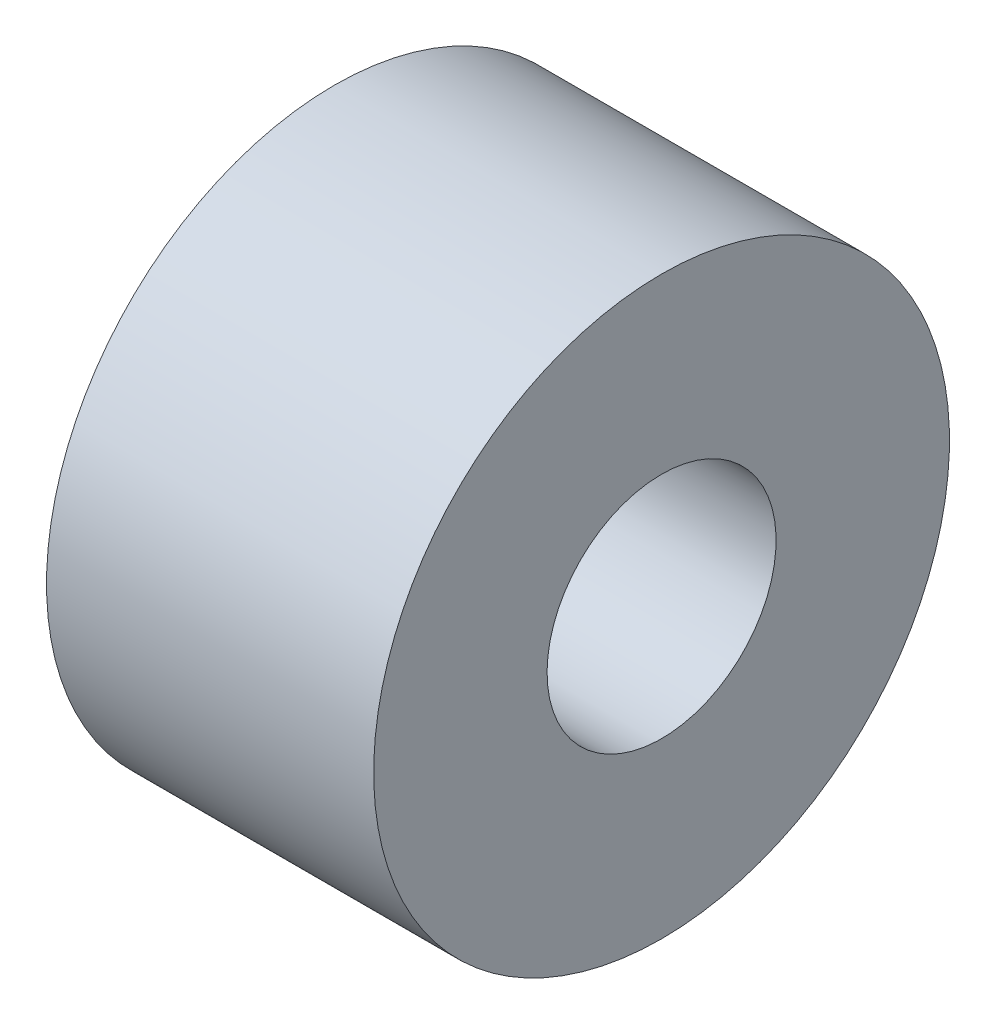
ISO-10303-21;
HEADER;
FILE_DESCRIPTION(('STEP AP214'),'2;1');
FILE_NAME('part.step','',(''),(''),'','','');
FILE_SCHEMA(('AUTOMOTIVE_DESIGN { 1 0 10303 214 1 1 1 1 }'));
ENDSEC;
DATA;
#1=APPLICATION_CONTEXT('core data for automotive mechanical design processes');
#2=APPLICATION_PROTOCOL_DEFINITION('international standard','automotive_design',2000,#1);
#3=PRODUCT_CONTEXT('',#1,'mechanical');
#4=PRODUCT('Part','Part','',(#3));
#5=PRODUCT_RELATED_PRODUCT_CATEGORY('part','',(#4));
#6=PRODUCT_DEFINITION_FORMATION('','',#4);
#7=PRODUCT_DEFINITION_CONTEXT('part definition',#1,'design');
#8=PRODUCT_DEFINITION('design','',#6,#7);
#9=PRODUCT_DEFINITION_SHAPE('','',#8);
#10=(LENGTH_UNIT() NAMED_UNIT(*) SI_UNIT(.MILLI.,.METRE.));
#11=(NAMED_UNIT(*) PLANE_ANGLE_UNIT() SI_UNIT($,.RADIAN.));
#12=(NAMED_UNIT(*) SI_UNIT($,.STERADIAN.) SOLID_ANGLE_UNIT());
#13=UNCERTAINTY_MEASURE_WITH_UNIT(LENGTH_MEASURE(1.E-05),#10,'distance_accuracy_value','');
#14=(GEOMETRIC_REPRESENTATION_CONTEXT(3) GLOBAL_UNCERTAINTY_ASSIGNED_CONTEXT((#13)) GLOBAL_UNIT_ASSIGNED_CONTEXT((#10,
#11,#12)) REPRESENTATION_CONTEXT('',''));
#15=CARTESIAN_POINT('',(0.,0.,0.));
#16=DIRECTION('',(0.,0.,1.));
#17=DIRECTION('',(1.,0.,0.));
#18=AXIS2_PLACEMENT_3D('',#15,#16,#17);
#19=CARTESIAN_POINT('',(43.1,-2.35608336515726,-40.657629981637));
#20=DIRECTION('',(1.,0.,0.));
#21=DIRECTION('',(0.,-0.17364817766693,-0.984807753012208));
#22=AXIS2_PLACEMENT_3D('',#19,#20,#21);
#23=CYLINDRICAL_SURFACE('',#22,1.75);
#24=CARTESIAN_POINT('',(48.1,-2.35608336515726,-40.657629981637));
#25=DIRECTION('',(-1.,0.,0.));
#26=DIRECTION('',(0.,-0.17364817766693,-0.984807753012208));
#27=AXIS2_PLACEMENT_3D('',#24,#25,#26);
#28=CIRCLE('',#27,1.75);
#29=CARTESIAN_POINT('',(48.1,-2.65996767607439,-42.3810435494084));
#30=VERTEX_POINT('',#29);
#31=EDGE_CURVE('E26',#30,#30,#28,.T.);
#32=ORIENTED_EDGE('',*,*,#31,.F.);
#33=EDGE_LOOP('',(#32));
#34=FACE_BOUND('',#33,.T.);
#35=CARTESIAN_POINT('',(43.1,-2.35608336515726,-40.657629981637));
#36=DIRECTION('',(-1.,0.,0.));
#37=DIRECTION('',(0.,-0.17364817766693,-0.984807753012208));
#38=AXIS2_PLACEMENT_3D('',#35,#36,#37);
#39=CIRCLE('',#38,1.75);
#40=CARTESIAN_POINT('',(43.1,-2.65996767607439,-42.3810435494084));
#41=VERTEX_POINT('',#40);
#42=EDGE_CURVE('E50',#41,#41,#39,.T.);
#43=ORIENTED_EDGE('',*,*,#42,.T.);
#44=EDGE_LOOP('',(#43));
#45=FACE_BOUND('',#44,.T.);
#46=ADVANCED_FACE('F17',(#34,#45),#23,.F.);
#47=CARTESIAN_POINT('',(43.1,-2.35608336515726,-40.657629981637));
#48=DIRECTION('',(1.,0.,0.));
#49=DIRECTION('',(0.,0.17364817766693,0.984807753012208));
#50=AXIS2_PLACEMENT_3D('',#47,#48,#49);
#51=CYLINDRICAL_SURFACE('',#50,4.4);
#52=CARTESIAN_POINT('',(48.1,-2.35608336515726,-40.657629981637));
#53=DIRECTION('',(1.,0.,0.));
#54=DIRECTION('',(0.,0.17364817766693,0.984807753012208));
#55=AXIS2_PLACEMENT_3D('',#52,#53,#54);
#56=CIRCLE('',#55,4.4);
#57=CARTESIAN_POINT('',(48.1,-1.59203138342277,-36.3244758683833));
#58=VERTEX_POINT('',#57);
#59=EDGE_CURVE('E11',#58,#58,#56,.T.);
#60=ORIENTED_EDGE('',*,*,#59,.F.);
#61=EDGE_LOOP('',(#60));
#62=FACE_BOUND('',#61,.T.);
#63=CARTESIAN_POINT('',(43.1,-2.35608336515726,-40.657629981637));
#64=DIRECTION('',(1.,0.,0.));
#65=DIRECTION('',(0.,0.17364817766693,0.984807753012208));
#66=AXIS2_PLACEMENT_3D('',#63,#64,#65);
#67=CIRCLE('',#66,4.4);
#68=CARTESIAN_POINT('',(43.1,-1.59203138342277,-36.3244758683833));
#69=VERTEX_POINT('',#68);
#70=EDGE_CURVE('E46',#69,#69,#67,.T.);
#71=ORIENTED_EDGE('',*,*,#70,.T.);
#72=EDGE_LOOP('',(#71));
#73=FACE_BOUND('',#72,.T.);
#74=ADVANCED_FACE('F47',(#62,#73),#51,.T.);
#75=CARTESIAN_POINT('',(48.1000010042103,-2.35608336515726,-40.657629981637));
#76=DIRECTION('',(1.,0.,0.));
#77=DIRECTION('',(0.,0.,1.));
#78=AXIS2_PLACEMENT_3D('',#75,#76,#77);
#79=PLANE('',#78);
#80=ORIENTED_EDGE('',*,*,#59,.T.);
#81=EDGE_LOOP('',(#80));
#82=FACE_BOUND('',#81,.T.);
#83=ORIENTED_EDGE('',*,*,#31,.T.);
#84=EDGE_LOOP('',(#83));
#85=FACE_BOUND('',#84,.T.);
#86=ADVANCED_FACE('F63',(#82,#85),#79,.T.);
#87=CARTESIAN_POINT('',(43.1000010042103,-2.35608336515726,-40.657629981637));
#88=DIRECTION('',(1.,0.,0.));
#89=DIRECTION('',(0.,0.,1.));
#90=AXIS2_PLACEMENT_3D('',#87,#88,#89);
#91=PLANE('',#90);
#92=ORIENTED_EDGE('',*,*,#70,.F.);
#93=EDGE_LOOP('',(#92));
#94=FACE_BOUND('',#93,.T.);
#95=ORIENTED_EDGE('',*,*,#42,.F.);
#96=EDGE_LOOP('',(#95));
#97=FACE_BOUND('',#96,.T.);
#98=ADVANCED_FACE('F61',(#94,#97),#91,.F.);
#99=CLOSED_SHELL('',(#46,#74,#86,#98));
#100=MANIFOLD_SOLID_BREP('B1',#99);
#101=ADVANCED_BREP_SHAPE_REPRESENTATION('',(#18,#100),#14);
#102=SHAPE_DEFINITION_REPRESENTATION(#9,#101);
ENDSEC;
END-ISO-10303-21;
